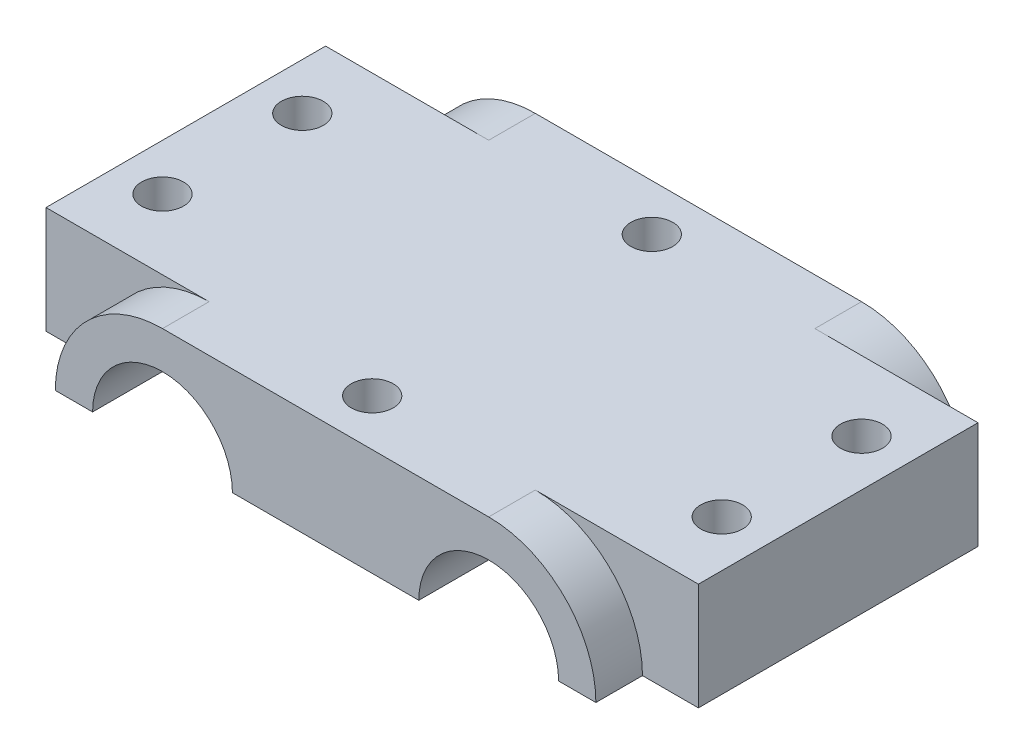
ISO-10303-21;
HEADER;
FILE_DESCRIPTION(('STEP AP214'),'2;1');
FILE_NAME('part.step','',(''),(''),'','','');
FILE_SCHEMA(('AUTOMOTIVE_DESIGN { 1 0 10303 214 1 1 1 1 }'));
ENDSEC;
DATA;
#1=APPLICATION_CONTEXT('core data for automotive mechanical design processes');
#2=APPLICATION_PROTOCOL_DEFINITION('international standard','automotive_design',2000,#1);
#3=PRODUCT_CONTEXT('',#1,'mechanical');
#4=PRODUCT('Part','Part','',(#3));
#5=PRODUCT_RELATED_PRODUCT_CATEGORY('part','',(#4));
#6=PRODUCT_DEFINITION_FORMATION('','',#4);
#7=PRODUCT_DEFINITION_CONTEXT('part definition',#1,'design');
#8=PRODUCT_DEFINITION('design','',#6,#7);
#9=PRODUCT_DEFINITION_SHAPE('','',#8);
#10=(LENGTH_UNIT() NAMED_UNIT(*) SI_UNIT(.MILLI.,.METRE.));
#11=(NAMED_UNIT(*) PLANE_ANGLE_UNIT() SI_UNIT($,.RADIAN.));
#12=(NAMED_UNIT(*) SI_UNIT($,.STERADIAN.) SOLID_ANGLE_UNIT());
#13=UNCERTAINTY_MEASURE_WITH_UNIT(LENGTH_MEASURE(1.E-05),#10,'distance_accuracy_value','');
#14=(GEOMETRIC_REPRESENTATION_CONTEXT(3) GLOBAL_UNCERTAINTY_ASSIGNED_CONTEXT((#13)) GLOBAL_UNIT_ASSIGNED_CONTEXT((#10,
#11,#12)) REPRESENTATION_CONTEXT('',''));
#15=CARTESIAN_POINT('',(0.,0.,0.));
#16=DIRECTION('',(0.,0.,1.));
#17=DIRECTION('',(1.,0.,0.));
#18=AXIS2_PLACEMENT_3D('',#15,#16,#17);
#19=CARTESIAN_POINT('',(-35.,5.75,20.));
#20=DIRECTION('',(0.,-1.,0.));
#21=DIRECTION('',(0.,0.,-1.));
#22=AXIS2_PLACEMENT_3D('',#19,#20,#21);
#23=PLANE('',#22);
#24=CARTESIAN_POINT('',(0.,5.75,-15.));
#25=DIRECTION('',(0.,1.,0.));
#26=DIRECTION('',(0.,0.,1.));
#27=AXIS2_PLACEMENT_3D('',#24,#25,#26);
#28=CIRCLE('',#27,2.24999999999999);
#29=CARTESIAN_POINT('',(0.,5.75,-12.75));
#30=VERTEX_POINT('',#29);
#31=EDGE_CURVE('E531',#30,#30,#28,.T.);
#32=ORIENTED_EDGE('',*,*,#31,.F.);
#33=EDGE_LOOP('',(#32));
#34=FACE_BOUND('',#33,.T.);
#35=CARTESIAN_POINT('',(0.,5.75,15.));
#36=DIRECTION('',(0.,1.,0.));
#37=DIRECTION('',(0.,0.,1.));
#38=AXIS2_PLACEMENT_3D('',#35,#36,#37);
#39=CIRCLE('',#38,2.24999999999999);
#40=CARTESIAN_POINT('',(0.,5.75,17.25));
#41=VERTEX_POINT('',#40);
#42=EDGE_CURVE('E533',#41,#41,#39,.T.);
#43=ORIENTED_EDGE('',*,*,#42,.F.);
#44=EDGE_LOOP('',(#43));
#45=FACE_BOUND('',#44,.T.);
#46=CARTESIAN_POINT('',(-30.,5.75,-7.5));
#47=DIRECTION('',(0.,1.,0.));
#48=DIRECTION('',(0.,0.,1.));
#49=AXIS2_PLACEMENT_3D('',#46,#47,#48);
#50=CIRCLE('',#49,2.25);
#51=CARTESIAN_POINT('',(-30.,5.75,-5.25));
#52=VERTEX_POINT('',#51);
#53=EDGE_CURVE('E541',#52,#52,#50,.T.);
#54=ORIENTED_EDGE('',*,*,#53,.F.);
#55=EDGE_LOOP('',(#54));
#56=FACE_BOUND('',#55,.T.);
#57=CARTESIAN_POINT('',(-30.,5.75,7.5));
#58=DIRECTION('',(0.,1.,0.));
#59=DIRECTION('',(0.,0.,1.));
#60=AXIS2_PLACEMENT_3D('',#57,#58,#59);
#61=CIRCLE('',#60,2.25);
#62=CARTESIAN_POINT('',(-30.,5.75,9.75));
#63=VERTEX_POINT('',#62);
#64=EDGE_CURVE('E547',#63,#63,#61,.T.);
#65=ORIENTED_EDGE('',*,*,#64,.F.);
#66=EDGE_LOOP('',(#65));
#67=FACE_BOUND('',#66,.T.);
#68=CARTESIAN_POINT('',(30.,5.75,7.5));
#69=DIRECTION('',(0.,1.,0.));
#70=DIRECTION('',(0.,0.,1.));
#71=AXIS2_PLACEMENT_3D('',#68,#69,#70);
#72=CIRCLE('',#71,2.25);
#73=CARTESIAN_POINT('',(30.,5.75,9.75));
#74=VERTEX_POINT('',#73);
#75=EDGE_CURVE('E559',#74,#74,#72,.T.);
#76=ORIENTED_EDGE('',*,*,#75,.F.);
#77=EDGE_LOOP('',(#76));
#78=FACE_BOUND('',#77,.T.);
#79=DIRECTION('',(-1.,0.,0.));
#80=VECTOR('',#79,1.);
#81=CARTESIAN_POINT('',(35.,5.75,-15.));
#82=LINE('',#81,#80);
#83=CARTESIAN_POINT('',(35.,5.75,-15.));
#84=VERTEX_POINT('',#83);
#85=CARTESIAN_POINT('',(17.5,5.75,-15.));
#86=VERTEX_POINT('',#85);
#87=EDGE_CURVE('E164',#84,#86,#82,.T.);
#88=ORIENTED_EDGE('',*,*,#87,.T.);
#89=DIRECTION('',(0.,0.,-1.));
#90=VECTOR('',#89,1.);
#91=CARTESIAN_POINT('',(17.5,5.75,-15.));
#92=LINE('',#91,#90);
#93=CARTESIAN_POINT('',(17.5,5.75,-20.));
#94=VERTEX_POINT('',#93);
#95=EDGE_CURVE('E151',#86,#94,#92,.T.);
#96=ORIENTED_EDGE('',*,*,#95,.T.);
#97=DIRECTION('',(-1.,0.,0.));
#98=VECTOR('',#97,1.);
#99=CARTESIAN_POINT('',(-35.,5.75,-20.));
#100=LINE('',#99,#98);
#101=CARTESIAN_POINT('',(-17.5,5.75,-20.));
#102=VERTEX_POINT('',#101);
#103=EDGE_CURVE('E241',#94,#102,#100,.T.);
#104=ORIENTED_EDGE('',*,*,#103,.T.);
#105=DIRECTION('',(0.,0.,-1.));
#106=VECTOR('',#105,1.);
#107=CARTESIAN_POINT('',(-17.5,5.75,-15.));
#108=LINE('',#107,#106);
#109=CARTESIAN_POINT('',(-17.5,5.75,-15.));
#110=VERTEX_POINT('',#109);
#111=EDGE_CURVE('E54',#110,#102,#108,.T.);
#112=ORIENTED_EDGE('',*,*,#111,.F.);
#113=DIRECTION('',(-1.,0.,0.));
#114=VECTOR('',#113,1.);
#115=CARTESIAN_POINT('',(-17.5,5.75,-15.));
#116=LINE('',#115,#114);
#117=CARTESIAN_POINT('',(-35.,5.75,-15.));
#118=VERTEX_POINT('',#117);
#119=EDGE_CURVE('E184',#110,#118,#116,.T.);
#120=ORIENTED_EDGE('',*,*,#119,.T.);
#121=DIRECTION('',(0.,0.,-1.));
#122=VECTOR('',#121,1.);
#123=CARTESIAN_POINT('',(-35.,5.75,20.));
#124=LINE('',#123,#122);
#125=CARTESIAN_POINT('',(-35.,5.75,15.));
#126=VERTEX_POINT('',#125);
#127=EDGE_CURVE('E47',#126,#118,#124,.T.);
#128=ORIENTED_EDGE('',*,*,#127,.F.);
#129=DIRECTION('',(-1.,0.,0.));
#130=VECTOR('',#129,1.);
#131=CARTESIAN_POINT('',(-17.5,5.75,15.));
#132=LINE('',#131,#130);
#133=CARTESIAN_POINT('',(-17.5,5.75,15.));
#134=VERTEX_POINT('',#133);
#135=EDGE_CURVE('E219',#134,#126,#132,.T.);
#136=ORIENTED_EDGE('',*,*,#135,.F.);
#137=DIRECTION('',(0.,0.,1.));
#138=VECTOR('',#137,1.);
#139=CARTESIAN_POINT('',(-17.5,5.75,15.));
#140=LINE('',#139,#138);
#141=CARTESIAN_POINT('',(-17.5,5.75,20.));
#142=VERTEX_POINT('',#141);
#143=EDGE_CURVE('E179',#134,#142,#140,.T.);
#144=ORIENTED_EDGE('',*,*,#143,.T.);
#145=DIRECTION('',(-1.,0.,0.));
#146=VECTOR('',#145,1.);
#147=CARTESIAN_POINT('',(-35.,5.75,20.));
#148=LINE('',#147,#146);
#149=CARTESIAN_POINT('',(17.5,5.75,20.));
#150=VERTEX_POINT('',#149);
#151=EDGE_CURVE('E253',#150,#142,#148,.T.);
#152=ORIENTED_EDGE('',*,*,#151,.F.);
#153=DIRECTION('',(0.,0.,1.));
#154=VECTOR('',#153,1.);
#155=CARTESIAN_POINT('',(17.5,5.75,15.));
#156=LINE('',#155,#154);
#157=CARTESIAN_POINT('',(17.5,5.75,15.));
#158=VERTEX_POINT('',#157);
#159=EDGE_CURVE('E212',#158,#150,#156,.T.);
#160=ORIENTED_EDGE('',*,*,#159,.F.);
#161=DIRECTION('',(-1.,0.,0.));
#162=VECTOR('',#161,1.);
#163=CARTESIAN_POINT('',(35.,5.75,15.));
#164=LINE('',#163,#162);
#165=CARTESIAN_POINT('',(35.,5.75,15.));
#166=VERTEX_POINT('',#165);
#167=EDGE_CURVE('E206',#166,#158,#164,.T.);
#168=ORIENTED_EDGE('',*,*,#167,.F.);
#169=DIRECTION('',(0.,0.,-1.));
#170=VECTOR('',#169,1.);
#171=CARTESIAN_POINT('',(35.,5.75,20.));
#172=LINE('',#171,#170);
#173=EDGE_CURVE('E11',#166,#84,#172,.T.);
#174=ORIENTED_EDGE('',*,*,#173,.T.);
#175=EDGE_LOOP('',(#88,#96,#104,#112,#120,#128,#136,#144,#152,#160,#168,#174));
#176=FACE_BOUND('',#175,.T.);
#177=CARTESIAN_POINT('',(30.,5.75,-7.5));
#178=DIRECTION('',(0.,1.,0.));
#179=DIRECTION('',(0.,0.,1.));
#180=AXIS2_PLACEMENT_3D('',#177,#178,#179);
#181=CIRCLE('',#180,2.25);
#182=CARTESIAN_POINT('',(30.,5.75,-5.25));
#183=VERTEX_POINT('',#182);
#184=EDGE_CURVE('E553',#183,#183,#181,.T.);
#185=ORIENTED_EDGE('',*,*,#184,.F.);
#186=EDGE_LOOP('',(#185));
#187=FACE_BOUND('',#186,.T.);
#188=ADVANCED_FACE('F39',(#34,#45,#56,#67,#78,#176,#187),#23,.F.);
#189=CARTESIAN_POINT('',(35.,5.75,20.));
#190=DIRECTION('',(-1.,0.,0.));
#191=DIRECTION('',(0.,-1.,0.));
#192=AXIS2_PLACEMENT_3D('',#189,#190,#191);
#193=PLANE('',#192);
#194=DIRECTION('',(0.,1.,0.));
#195=VECTOR('',#194,1.);
#196=CARTESIAN_POINT('',(35.,-5.75,-15.));
#197=LINE('',#196,#195);
#198=CARTESIAN_POINT('',(35.,-5.75,-15.));
#199=VERTEX_POINT('',#198);
#200=EDGE_CURVE('E171',#199,#84,#197,.T.);
#201=ORIENTED_EDGE('',*,*,#200,.T.);
#202=ORIENTED_EDGE('',*,*,#173,.F.);
#203=DIRECTION('',(0.,1.,0.));
#204=VECTOR('',#203,1.);
#205=CARTESIAN_POINT('',(35.,-5.75,15.));
#206=LINE('',#205,#204);
#207=CARTESIAN_POINT('',(35.,-5.75,15.));
#208=VERTEX_POINT('',#207);
#209=EDGE_CURVE('E204',#208,#166,#206,.T.);
#210=ORIENTED_EDGE('',*,*,#209,.F.);
#211=DIRECTION('',(0.,0.,-1.));
#212=VECTOR('',#211,1.);
#213=CARTESIAN_POINT('',(35.,-5.75,20.));
#214=LINE('',#213,#212);
#215=EDGE_CURVE('E260',#208,#199,#214,.T.);
#216=ORIENTED_EDGE('',*,*,#215,.T.);
#217=EDGE_LOOP('',(#201,#202,#210,#216));
#218=FACE_BOUND('',#217,.T.);
#219=ADVANCED_FACE('F41',(#218),#193,.F.);
#220=CARTESIAN_POINT('',(-35.,-5.75,20.));
#221=DIRECTION('',(0.,1.,0.));
#222=DIRECTION('',(0.,0.,1.));
#223=AXIS2_PLACEMENT_3D('',#220,#221,#222);
#224=PLANE('',#223);
#225=CARTESIAN_POINT('',(-30.,-5.75,-7.5));
#226=DIRECTION('',(0.,1.,0.));
#227=DIRECTION('',(0.,0.,1.));
#228=AXIS2_PLACEMENT_3D('',#225,#226,#227);
#229=CIRCLE('',#228,2.25);
#230=CARTESIAN_POINT('',(-30.,-5.75,-5.25));
#231=VERTEX_POINT('',#230);
#232=EDGE_CURVE('E544',#231,#231,#229,.T.);
#233=ORIENTED_EDGE('',*,*,#232,.T.);
#234=EDGE_LOOP('',(#233));
#235=FACE_BOUND('',#234,.T.);
#236=CARTESIAN_POINT('',(-30.,-5.75,7.5));
#237=DIRECTION('',(0.,1.,0.));
#238=DIRECTION('',(0.,0.,1.));
#239=AXIS2_PLACEMENT_3D('',#236,#237,#238);
#240=CIRCLE('',#239,2.25);
#241=CARTESIAN_POINT('',(-30.,-5.75,9.75));
#242=VERTEX_POINT('',#241);
#243=EDGE_CURVE('E550',#242,#242,#240,.T.);
#244=ORIENTED_EDGE('',*,*,#243,.T.);
#245=EDGE_LOOP('',(#244));
#246=FACE_BOUND('',#245,.T.);
#247=DIRECTION('',(0.,0.,-1.));
#248=VECTOR('',#247,1.);
#249=CARTESIAN_POINT('',(-29.,-5.75,-15.));
#250=LINE('',#249,#248);
#251=CARTESIAN_POINT('',(-29.,-5.75,-15.));
#252=VERTEX_POINT('',#251);
#253=CARTESIAN_POINT('',(-29.,-5.75,-20.));
#254=VERTEX_POINT('',#253);
#255=EDGE_CURVE('E178',#252,#254,#250,.T.);
#256=ORIENTED_EDGE('',*,*,#255,.T.);
#257=DIRECTION('',(1.,0.,0.));
#258=VECTOR('',#257,1.);
#259=CARTESIAN_POINT('',(-35.,-5.75,-20.));
#260=LINE('',#259,#258);
#261=CARTESIAN_POINT('',(-25.,-5.75,-20.));
#262=VERTEX_POINT('',#261);
#263=EDGE_CURVE('E257',#254,#262,#260,.T.);
#264=ORIENTED_EDGE('',*,*,#263,.T.);
#265=DIRECTION('',(0.,0.,1.));
#266=VECTOR('',#265,1.);
#267=CARTESIAN_POINT('',(-25.,-5.75,-20.));
#268=LINE('',#267,#266);
#269=CARTESIAN_POINT('',(-25.,-5.75,20.));
#270=VERTEX_POINT('',#269);
#271=EDGE_CURVE('E244',#262,#270,#268,.T.);
#272=ORIENTED_EDGE('',*,*,#271,.T.);
#273=DIRECTION('',(1.,0.,0.));
#274=VECTOR('',#273,1.);
#275=CARTESIAN_POINT('',(-35.,-5.75,20.));
#276=LINE('',#275,#274);
#277=CARTESIAN_POINT('',(-29.,-5.75,20.));
#278=VERTEX_POINT('',#277);
#279=EDGE_CURVE('E258',#278,#270,#276,.T.);
#280=ORIENTED_EDGE('',*,*,#279,.F.);
#281=DIRECTION('',(0.,0.,1.));
#282=VECTOR('',#281,1.);
#283=CARTESIAN_POINT('',(-29.,-5.75,15.));
#284=LINE('',#283,#282);
#285=CARTESIAN_POINT('',(-29.,-5.75,15.));
#286=VERTEX_POINT('',#285);
#287=EDGE_CURVE('E217',#286,#278,#284,.T.);
#288=ORIENTED_EDGE('',*,*,#287,.F.);
#289=DIRECTION('',(1.,0.,0.));
#290=VECTOR('',#289,1.);
#291=CARTESIAN_POINT('',(-35.,-5.75,15.));
#292=LINE('',#291,#290);
#293=CARTESIAN_POINT('',(-35.,-5.75,15.));
#294=VERTEX_POINT('',#293);
#295=EDGE_CURVE('E228',#294,#286,#292,.T.);
#296=ORIENTED_EDGE('',*,*,#295,.F.);
#297=DIRECTION('',(0.,0.,-1.));
#298=VECTOR('',#297,1.);
#299=CARTESIAN_POINT('',(-35.,-5.75,20.));
#300=LINE('',#299,#298);
#301=CARTESIAN_POINT('',(-35.,-5.75,-15.));
#302=VERTEX_POINT('',#301);
#303=EDGE_CURVE('E268',#294,#302,#300,.T.);
#304=ORIENTED_EDGE('',*,*,#303,.T.);
#305=DIRECTION('',(1.,0.,0.));
#306=VECTOR('',#305,1.);
#307=CARTESIAN_POINT('',(-35.,-5.75,-15.));
#308=LINE('',#307,#306);
#309=EDGE_CURVE('E190',#302,#252,#308,.T.);
#310=ORIENTED_EDGE('',*,*,#309,.T.);
#311=EDGE_LOOP('',(#256,#264,#272,#280,#288,#296,#304,#310));
#312=FACE_BOUND('',#311,.T.);
#313=ADVANCED_FACE('F282',(#235,#246,#312),#224,.F.);
#314=CARTESIAN_POINT('',(30.,-5.75,-7.5));
#315=DIRECTION('',(0.,1.,0.));
#316=DIRECTION('',(0.,0.,1.));
#317=AXIS2_PLACEMENT_3D('',#314,#315,#316);
#318=CIRCLE('',#317,2.25);
#319=CARTESIAN_POINT('',(30.,-5.75,-5.25));
#320=VERTEX_POINT('',#319);
#321=EDGE_CURVE('E556',#320,#320,#318,.T.);
#322=ORIENTED_EDGE('',*,*,#321,.T.);
#323=EDGE_LOOP('',(#322));
#324=FACE_BOUND('',#323,.T.);
#325=CARTESIAN_POINT('',(30.,-5.75,7.5));
#326=DIRECTION('',(0.,1.,0.));
#327=DIRECTION('',(0.,0.,1.));
#328=AXIS2_PLACEMENT_3D('',#325,#326,#327);
#329=CIRCLE('',#328,2.25);
#330=CARTESIAN_POINT('',(30.,-5.75,9.75));
#331=VERTEX_POINT('',#330);
#332=EDGE_CURVE('E194',#331,#331,#329,.T.);
#333=ORIENTED_EDGE('',*,*,#332,.T.);
#334=EDGE_LOOP('',(#333));
#335=FACE_BOUND('',#334,.T.);
#336=DIRECTION('',(0.,0.,-1.));
#337=VECTOR('',#336,1.);
#338=CARTESIAN_POINT('',(29.,-5.75,-15.));
#339=LINE('',#338,#337);
#340=CARTESIAN_POINT('',(29.,-5.75,-15.));
#341=VERTEX_POINT('',#340);
#342=CARTESIAN_POINT('',(29.,-5.75,-20.));
#343=VERTEX_POINT('',#342);
#344=EDGE_CURVE('E62',#341,#343,#339,.T.);
#345=ORIENTED_EDGE('',*,*,#344,.F.);
#346=DIRECTION('',(1.,0.,0.));
#347=VECTOR('',#346,1.);
#348=CARTESIAN_POINT('',(29.,-5.75,-15.));
#349=LINE('',#348,#347);
#350=EDGE_CURVE('E160',#341,#199,#349,.T.);
#351=ORIENTED_EDGE('',*,*,#350,.T.);
#352=ORIENTED_EDGE('',*,*,#215,.F.);
#353=DIRECTION('',(1.,0.,0.));
#354=VECTOR('',#353,1.);
#355=CARTESIAN_POINT('',(29.,-5.75,15.));
#356=LINE('',#355,#354);
#357=CARTESIAN_POINT('',(29.,-5.75,15.));
#358=VERTEX_POINT('',#357);
#359=EDGE_CURVE('E201',#358,#208,#356,.T.);
#360=ORIENTED_EDGE('',*,*,#359,.F.);
#361=DIRECTION('',(0.,0.,1.));
#362=VECTOR('',#361,1.);
#363=CARTESIAN_POINT('',(29.,-5.75,15.));
#364=LINE('',#363,#362);
#365=CARTESIAN_POINT('',(29.,-5.75,20.));
#366=VERTEX_POINT('',#365);
#367=EDGE_CURVE('E209',#358,#366,#364,.T.);
#368=ORIENTED_EDGE('',*,*,#367,.T.);
#369=CARTESIAN_POINT('',(25.,-5.75,20.));
#370=VERTEX_POINT('',#369);
#371=EDGE_CURVE('E256',#370,#366,#276,.T.);
#372=ORIENTED_EDGE('',*,*,#371,.F.);
#373=DIRECTION('',(0.,0.,1.));
#374=VECTOR('',#373,1.);
#375=CARTESIAN_POINT('',(25.,-5.75,-20.));
#376=LINE('',#375,#374);
#377=CARTESIAN_POINT('',(25.,-5.75,-20.));
#378=VERTEX_POINT('',#377);
#379=EDGE_CURVE('E239',#378,#370,#376,.T.);
#380=ORIENTED_EDGE('',*,*,#379,.F.);
#381=EDGE_CURVE('E263',#378,#343,#260,.T.);
#382=ORIENTED_EDGE('',*,*,#381,.T.);
#383=EDGE_LOOP('',(#345,#351,#352,#360,#368,#372,#380,#382));
#384=FACE_BOUND('',#383,.T.);
#385=ADVANCED_FACE('F304',(#324,#335,#384),#224,.F.);
#386=CARTESIAN_POINT('',(0.,0.,-20.));
#387=DIRECTION('',(0.,0.,1.));
#388=DIRECTION('',(1.,0.,0.));
#389=AXIS2_PLACEMENT_3D('',#386,#387,#388);
#390=PLANE('',#389);
#391=CARTESIAN_POINT('',(17.5,-5.75,-20.));
#392=DIRECTION('',(0.,0.,-1.));
#393=DIRECTION('',(1.,0.,0.));
#394=AXIS2_PLACEMENT_3D('',#391,#392,#393);
#395=CIRCLE('',#394,11.5);
#396=EDGE_CURVE('E155',#94,#343,#395,.T.);
#397=ORIENTED_EDGE('',*,*,#396,.T.);
#398=ORIENTED_EDGE('',*,*,#381,.F.);
#399=CARTESIAN_POINT('',(17.5,-5.75,-20.));
#400=DIRECTION('',(0.,0.,1.));
#401=DIRECTION('',(-1.,0.,0.));
#402=AXIS2_PLACEMENT_3D('',#399,#400,#401);
#403=CIRCLE('',#402,7.5);
#404=CARTESIAN_POINT('',(10.,-5.75,-20.));
#405=VERTEX_POINT('',#404);
#406=EDGE_CURVE('E232',#378,#405,#403,.T.);
#407=ORIENTED_EDGE('',*,*,#406,.T.);
#408=CARTESIAN_POINT('',(-10.,-5.75,-20.));
#409=VERTEX_POINT('',#408);
#410=EDGE_CURVE('E265',#409,#405,#260,.T.);
#411=ORIENTED_EDGE('',*,*,#410,.F.);
#412=CARTESIAN_POINT('',(-17.5,-5.75,-20.));
#413=DIRECTION('',(0.,0.,1.));
#414=DIRECTION('',(1.,0.,0.));
#415=AXIS2_PLACEMENT_3D('',#412,#413,#414);
#416=CIRCLE('',#415,7.5);
#417=EDGE_CURVE('E247',#409,#262,#416,.T.);
#418=ORIENTED_EDGE('',*,*,#417,.T.);
#419=ORIENTED_EDGE('',*,*,#263,.F.);
#420=CARTESIAN_POINT('',(-17.5,-5.75,-20.));
#421=DIRECTION('',(0.,0.,-1.));
#422=DIRECTION('',(-1.,0.,0.));
#423=AXIS2_PLACEMENT_3D('',#420,#421,#422);
#424=CIRCLE('',#423,11.5);
#425=EDGE_CURVE('E185',#254,#102,#424,.T.);
#426=ORIENTED_EDGE('',*,*,#425,.T.);
#427=ORIENTED_EDGE('',*,*,#103,.F.);
#428=EDGE_LOOP('',(#397,#398,#407,#411,#418,#419,#426,#427));
#429=FACE_BOUND('',#428,.T.);
#430=ADVANCED_FACE('F321',(#429),#390,.F.);
#431=CARTESIAN_POINT('',(0.,-5.75,-15.));
#432=DIRECTION('',(0.,1.,0.));
#433=DIRECTION('',(0.,0.,1.));
#434=AXIS2_PLACEMENT_3D('',#431,#432,#433);
#435=CIRCLE('',#434,2.25);
#436=CARTESIAN_POINT('',(0.,-5.75,-12.75));
#437=VERTEX_POINT('',#436);
#438=EDGE_CURVE('E529',#437,#437,#435,.T.);
#439=ORIENTED_EDGE('',*,*,#438,.T.);
#440=EDGE_LOOP('',(#439));
#441=FACE_BOUND('',#440,.T.);
#442=CARTESIAN_POINT('',(0.,-5.75,15.));
#443=DIRECTION('',(0.,1.,0.));
#444=DIRECTION('',(0.,0.,1.));
#445=AXIS2_PLACEMENT_3D('',#442,#443,#444);
#446=CIRCLE('',#445,2.25);
#447=CARTESIAN_POINT('',(0.,-5.75,17.25));
#448=VERTEX_POINT('',#447);
#449=EDGE_CURVE('E538',#448,#448,#446,.T.);
#450=ORIENTED_EDGE('',*,*,#449,.T.);
#451=EDGE_LOOP('',(#450));
#452=FACE_BOUND('',#451,.T.);
#453=ORIENTED_EDGE('',*,*,#410,.T.);
#454=DIRECTION('',(0.,0.,1.));
#455=VECTOR('',#454,1.);
#456=CARTESIAN_POINT('',(10.,-5.75,-20.));
#457=LINE('',#456,#455);
#458=CARTESIAN_POINT('',(10.,-5.75,20.));
#459=VERTEX_POINT('',#458);
#460=EDGE_CURVE('E235',#405,#459,#457,.T.);
#461=ORIENTED_EDGE('',*,*,#460,.T.);
#462=CARTESIAN_POINT('',(-10.,-5.75,20.));
#463=VERTEX_POINT('',#462);
#464=EDGE_CURVE('E261',#463,#459,#276,.T.);
#465=ORIENTED_EDGE('',*,*,#464,.F.);
#466=DIRECTION('',(0.,0.,1.));
#467=VECTOR('',#466,1.);
#468=CARTESIAN_POINT('',(-10.,-5.75,-20.));
#469=LINE('',#468,#467);
#470=EDGE_CURVE('E214',#409,#463,#469,.T.);
#471=ORIENTED_EDGE('',*,*,#470,.F.);
#472=EDGE_LOOP('',(#453,#461,#465,#471));
#473=FACE_BOUND('',#472,.T.);
#474=ADVANCED_FACE('F318',(#441,#452,#473),#224,.F.);
#475=CARTESIAN_POINT('',(-35.,5.75,20.));
#476=DIRECTION('',(1.,0.,0.));
#477=DIRECTION('',(0.,0.,-1.));
#478=AXIS2_PLACEMENT_3D('',#475,#476,#477);
#479=PLANE('',#478);
#480=ORIENTED_EDGE('',*,*,#127,.T.);
#481=DIRECTION('',(0.,-1.,0.));
#482=VECTOR('',#481,1.);
#483=CARTESIAN_POINT('',(-35.,5.75,-15.));
#484=LINE('',#483,#482);
#485=EDGE_CURVE('E181',#118,#302,#484,.T.);
#486=ORIENTED_EDGE('',*,*,#485,.T.);
#487=ORIENTED_EDGE('',*,*,#303,.F.);
#488=DIRECTION('',(0.,-1.,0.));
#489=VECTOR('',#488,1.);
#490=CARTESIAN_POINT('',(-35.,5.75,15.));
#491=LINE('',#490,#489);
#492=EDGE_CURVE('E223',#126,#294,#491,.T.);
#493=ORIENTED_EDGE('',*,*,#492,.F.);
#494=EDGE_LOOP('',(#480,#486,#487,#493));
#495=FACE_BOUND('',#494,.T.);
#496=ADVANCED_FACE('F274',(#495),#479,.F.);
#497=CARTESIAN_POINT('',(0.,0.,20.));
#498=DIRECTION('',(0.,0.,1.));
#499=DIRECTION('',(1.,0.,0.));
#500=AXIS2_PLACEMENT_3D('',#497,#498,#499);
#501=PLANE('',#500);
#502=CARTESIAN_POINT('',(17.5,-5.75,20.));
#503=DIRECTION('',(0.,0.,-1.));
#504=DIRECTION('',(1.,0.,0.));
#505=AXIS2_PLACEMENT_3D('',#502,#503,#504);
#506=CIRCLE('',#505,11.5);
#507=EDGE_CURVE('E202',#150,#366,#506,.T.);
#508=ORIENTED_EDGE('',*,*,#507,.F.);
#509=ORIENTED_EDGE('',*,*,#151,.T.);
#510=CARTESIAN_POINT('',(-17.5,-5.75,20.));
#511=DIRECTION('',(0.,0.,-1.));
#512=DIRECTION('',(-1.,0.,0.));
#513=AXIS2_PLACEMENT_3D('',#510,#511,#512);
#514=CIRCLE('',#513,11.5);
#515=EDGE_CURVE('E211',#278,#142,#514,.T.);
#516=ORIENTED_EDGE('',*,*,#515,.F.);
#517=ORIENTED_EDGE('',*,*,#279,.T.);
#518=CARTESIAN_POINT('',(-17.5,-5.75,20.));
#519=DIRECTION('',(0.,0.,1.));
#520=DIRECTION('',(1.,0.,0.));
#521=AXIS2_PLACEMENT_3D('',#518,#519,#520);
#522=CIRCLE('',#521,7.5);
#523=EDGE_CURVE('E238',#463,#270,#522,.T.);
#524=ORIENTED_EDGE('',*,*,#523,.F.);
#525=ORIENTED_EDGE('',*,*,#464,.T.);
#526=CARTESIAN_POINT('',(17.5,-5.75,20.));
#527=DIRECTION('',(0.,0.,1.));
#528=DIRECTION('',(-1.,0.,0.));
#529=AXIS2_PLACEMENT_3D('',#526,#527,#528);
#530=CIRCLE('',#529,7.5);
#531=EDGE_CURVE('E236',#370,#459,#530,.T.);
#532=ORIENTED_EDGE('',*,*,#531,.F.);
#533=ORIENTED_EDGE('',*,*,#371,.T.);
#534=EDGE_LOOP('',(#508,#509,#516,#517,#524,#525,#532,#533));
#535=FACE_BOUND('',#534,.T.);
#536=ADVANCED_FACE('F296',(#535),#501,.T.);
#537=CARTESIAN_POINT('',(-17.5,-5.75,-20.));
#538=DIRECTION('',(0.,0.,1.));
#539=DIRECTION('',(1.,0.,0.));
#540=AXIS2_PLACEMENT_3D('',#537,#538,#539);
#541=CYLINDRICAL_SURFACE('',#540,7.5);
#542=ORIENTED_EDGE('',*,*,#523,.T.);
#543=ORIENTED_EDGE('',*,*,#271,.F.);
#544=ORIENTED_EDGE('',*,*,#417,.F.);
#545=ORIENTED_EDGE('',*,*,#470,.T.);
#546=EDGE_LOOP('',(#542,#543,#544,#545));
#547=FACE_BOUND('',#546,.T.);
#548=ADVANCED_FACE('F327',(#547),#541,.F.);
#549=CARTESIAN_POINT('',(17.5,-5.75,-20.));
#550=DIRECTION('',(0.,0.,1.));
#551=DIRECTION('',(1.,0.,0.));
#552=AXIS2_PLACEMENT_3D('',#549,#550,#551);
#553=CYLINDRICAL_SURFACE('',#552,7.5);
#554=ORIENTED_EDGE('',*,*,#531,.T.);
#555=ORIENTED_EDGE('',*,*,#460,.F.);
#556=ORIENTED_EDGE('',*,*,#406,.F.);
#557=ORIENTED_EDGE('',*,*,#379,.T.);
#558=EDGE_LOOP('',(#554,#555,#556,#557));
#559=FACE_BOUND('',#558,.T.);
#560=ADVANCED_FACE('F323',(#559),#553,.F.);
#561=CARTESIAN_POINT('',(-17.5,-5.75,15.));
#562=DIRECTION('',(0.,0.,1.));
#563=DIRECTION('',(1.,0.,0.));
#564=AXIS2_PLACEMENT_3D('',#561,#562,#563);
#565=CYLINDRICAL_SURFACE('',#564,11.5);
#566=ORIENTED_EDGE('',*,*,#515,.T.);
#567=ORIENTED_EDGE('',*,*,#143,.F.);
#568=CARTESIAN_POINT('',(-17.5,-5.75,15.));
#569=DIRECTION('',(0.,0.,-1.));
#570=DIRECTION('',(-1.,0.,0.));
#571=AXIS2_PLACEMENT_3D('',#568,#569,#570);
#572=CIRCLE('',#571,11.5);
#573=EDGE_CURVE('E225',#286,#134,#572,.T.);
#574=ORIENTED_EDGE('',*,*,#573,.F.);
#575=ORIENTED_EDGE('',*,*,#287,.T.);
#576=EDGE_LOOP('',(#566,#567,#574,#575));
#577=FACE_BOUND('',#576,.T.);
#578=ADVANCED_FACE('F290',(#577),#565,.T.);
#579=CARTESIAN_POINT('',(-17.5,-5.75,15.));
#580=DIRECTION('',(0.,0.,-1.));
#581=DIRECTION('',(-1.,0.,0.));
#582=AXIS2_PLACEMENT_3D('',#579,#580,#581);
#583=PLANE('',#582);
#584=ORIENTED_EDGE('',*,*,#492,.T.);
#585=ORIENTED_EDGE('',*,*,#295,.T.);
#586=ORIENTED_EDGE('',*,*,#573,.T.);
#587=ORIENTED_EDGE('',*,*,#135,.T.);
#588=EDGE_LOOP('',(#584,#585,#586,#587));
#589=FACE_BOUND('',#588,.T.);
#590=ADVANCED_FACE('F288',(#589),#583,.F.);
#591=CARTESIAN_POINT('',(17.5,-5.75,15.));
#592=DIRECTION('',(0.,0.,1.));
#593=DIRECTION('',(1.,0.,0.));
#594=AXIS2_PLACEMENT_3D('',#591,#592,#593);
#595=CYLINDRICAL_SURFACE('',#594,11.5);
#596=ORIENTED_EDGE('',*,*,#507,.T.);
#597=ORIENTED_EDGE('',*,*,#367,.F.);
#598=CARTESIAN_POINT('',(17.5,-5.75,15.));
#599=DIRECTION('',(0.,0.,-1.));
#600=DIRECTION('',(1.,0.,0.));
#601=AXIS2_PLACEMENT_3D('',#598,#599,#600);
#602=CIRCLE('',#601,11.5);
#603=EDGE_CURVE('E198',#158,#358,#602,.T.);
#604=ORIENTED_EDGE('',*,*,#603,.F.);
#605=ORIENTED_EDGE('',*,*,#159,.T.);
#606=EDGE_LOOP('',(#596,#597,#604,#605));
#607=FACE_BOUND('',#606,.T.);
#608=ADVANCED_FACE('F301',(#607),#595,.T.);
#609=CARTESIAN_POINT('',(17.5,-5.75,15.));
#610=DIRECTION('',(0.,0.,1.));
#611=DIRECTION('',(1.,0.,0.));
#612=AXIS2_PLACEMENT_3D('',#609,#610,#611);
#613=PLANE('',#612);
#614=ORIENTED_EDGE('',*,*,#603,.T.);
#615=ORIENTED_EDGE('',*,*,#359,.T.);
#616=ORIENTED_EDGE('',*,*,#209,.T.);
#617=ORIENTED_EDGE('',*,*,#167,.T.);
#618=EDGE_LOOP('',(#614,#615,#616,#617));
#619=FACE_BOUND('',#618,.T.);
#620=ADVANCED_FACE('F309',(#619),#613,.T.);
#621=CARTESIAN_POINT('',(-17.5,-5.75,-15.));
#622=DIRECTION('',(0.,0.,-1.));
#623=DIRECTION('',(-1.,0.,0.));
#624=AXIS2_PLACEMENT_3D('',#621,#622,#623);
#625=CYLINDRICAL_SURFACE('',#624,11.5);
#626=ORIENTED_EDGE('',*,*,#425,.F.);
#627=ORIENTED_EDGE('',*,*,#255,.F.);
#628=CARTESIAN_POINT('',(-17.5,-5.75,-15.));
#629=DIRECTION('',(0.,0.,-1.));
#630=DIRECTION('',(-1.,0.,0.));
#631=AXIS2_PLACEMENT_3D('',#628,#629,#630);
#632=CIRCLE('',#631,11.5);
#633=EDGE_CURVE('E188',#252,#110,#632,.T.);
#634=ORIENTED_EDGE('',*,*,#633,.T.);
#635=ORIENTED_EDGE('',*,*,#111,.T.);
#636=EDGE_LOOP('',(#626,#627,#634,#635));
#637=FACE_BOUND('',#636,.T.);
#638=ADVANCED_FACE('F328',(#637),#625,.T.);
#639=CARTESIAN_POINT('',(-17.5,-5.75,-15.));
#640=DIRECTION('',(0.,0.,1.));
#641=DIRECTION('',(-1.,0.,0.));
#642=AXIS2_PLACEMENT_3D('',#639,#640,#641);
#643=PLANE('',#642);
#644=ORIENTED_EDGE('',*,*,#485,.F.);
#645=ORIENTED_EDGE('',*,*,#119,.F.);
#646=ORIENTED_EDGE('',*,*,#633,.F.);
#647=ORIENTED_EDGE('',*,*,#309,.F.);
#648=EDGE_LOOP('',(#644,#645,#646,#647));
#649=FACE_BOUND('',#648,.T.);
#650=ADVANCED_FACE('F280',(#649),#643,.F.);
#651=CARTESIAN_POINT('',(17.5,-5.75,-15.));
#652=DIRECTION('',(0.,0.,-1.));
#653=DIRECTION('',(-1.,0.,0.));
#654=AXIS2_PLACEMENT_3D('',#651,#652,#653);
#655=CYLINDRICAL_SURFACE('',#654,11.5);
#656=ORIENTED_EDGE('',*,*,#396,.F.);
#657=ORIENTED_EDGE('',*,*,#95,.F.);
#658=CARTESIAN_POINT('',(17.5,-5.75,-15.));
#659=DIRECTION('',(0.,0.,-1.));
#660=DIRECTION('',(1.,0.,0.));
#661=AXIS2_PLACEMENT_3D('',#658,#659,#660);
#662=CIRCLE('',#661,11.5);
#663=EDGE_CURVE('E154',#86,#341,#662,.T.);
#664=ORIENTED_EDGE('',*,*,#663,.T.);
#665=ORIENTED_EDGE('',*,*,#344,.T.);
#666=EDGE_LOOP('',(#656,#657,#664,#665));
#667=FACE_BOUND('',#666,.T.);
#668=ADVANCED_FACE('F153',(#667),#655,.T.);
#669=CARTESIAN_POINT('',(17.5,-5.75,-15.));
#670=DIRECTION('',(0.,0.,-1.));
#671=DIRECTION('',(1.,0.,0.));
#672=AXIS2_PLACEMENT_3D('',#669,#670,#671);
#673=PLANE('',#672);
#674=ORIENTED_EDGE('',*,*,#663,.F.);
#675=ORIENTED_EDGE('',*,*,#87,.F.);
#676=ORIENTED_EDGE('',*,*,#200,.F.);
#677=ORIENTED_EDGE('',*,*,#350,.F.);
#678=EDGE_LOOP('',(#674,#675,#676,#677));
#679=FACE_BOUND('',#678,.T.);
#680=ADVANCED_FACE('F163',(#679),#673,.T.);
#681=CARTESIAN_POINT('',(30.,5.75,7.5));
#682=DIRECTION('',(0.,1.,0.));
#683=DIRECTION('',(0.,0.,1.));
#684=AXIS2_PLACEMENT_3D('',#681,#682,#683);
#685=CYLINDRICAL_SURFACE('',#684,2.25);
#686=ORIENTED_EDGE('',*,*,#332,.F.);
#687=EDGE_LOOP('',(#686));
#688=FACE_BOUND('',#687,.T.);
#689=ORIENTED_EDGE('',*,*,#75,.T.);
#690=EDGE_LOOP('',(#689));
#691=FACE_BOUND('',#690,.T.);
#692=ADVANCED_FACE('F466',(#688,#691),#685,.F.);
#693=CARTESIAN_POINT('',(30.,5.75,-7.5));
#694=DIRECTION('',(0.,1.,0.));
#695=DIRECTION('',(0.,0.,1.));
#696=AXIS2_PLACEMENT_3D('',#693,#694,#695);
#697=CYLINDRICAL_SURFACE('',#696,2.25);
#698=ORIENTED_EDGE('',*,*,#321,.F.);
#699=EDGE_LOOP('',(#698));
#700=FACE_BOUND('',#699,.T.);
#701=ORIENTED_EDGE('',*,*,#184,.T.);
#702=EDGE_LOOP('',(#701));
#703=FACE_BOUND('',#702,.T.);
#704=ADVANCED_FACE('F473',(#700,#703),#697,.F.);
#705=CARTESIAN_POINT('',(-30.,5.75,7.5));
#706=DIRECTION('',(0.,1.,0.));
#707=DIRECTION('',(0.,0.,1.));
#708=AXIS2_PLACEMENT_3D('',#705,#706,#707);
#709=CYLINDRICAL_SURFACE('',#708,2.25);
#710=ORIENTED_EDGE('',*,*,#243,.F.);
#711=EDGE_LOOP('',(#710));
#712=FACE_BOUND('',#711,.T.);
#713=ORIENTED_EDGE('',*,*,#64,.T.);
#714=EDGE_LOOP('',(#713));
#715=FACE_BOUND('',#714,.T.);
#716=ADVANCED_FACE('F486',(#712,#715),#709,.F.);
#717=CARTESIAN_POINT('',(-30.,5.75,-7.5));
#718=DIRECTION('',(0.,1.,0.));
#719=DIRECTION('',(0.,0.,1.));
#720=AXIS2_PLACEMENT_3D('',#717,#718,#719);
#721=CYLINDRICAL_SURFACE('',#720,2.25);
#722=ORIENTED_EDGE('',*,*,#232,.F.);
#723=EDGE_LOOP('',(#722));
#724=FACE_BOUND('',#723,.T.);
#725=ORIENTED_EDGE('',*,*,#53,.T.);
#726=EDGE_LOOP('',(#725));
#727=FACE_BOUND('',#726,.T.);
#728=ADVANCED_FACE('F495',(#724,#727),#721,.F.);
#729=CARTESIAN_POINT('',(0.,5.75,15.));
#730=DIRECTION('',(0.,1.,0.));
#731=DIRECTION('',(0.,0.,1.));
#732=AXIS2_PLACEMENT_3D('',#729,#730,#731);
#733=CYLINDRICAL_SURFACE('',#732,2.24999999999999);
#734=ORIENTED_EDGE('',*,*,#449,.F.);
#735=EDGE_LOOP('',(#734));
#736=FACE_BOUND('',#735,.T.);
#737=ORIENTED_EDGE('',*,*,#42,.T.);
#738=EDGE_LOOP('',(#737));
#739=FACE_BOUND('',#738,.T.);
#740=ADVANCED_FACE('F504',(#736,#739),#733,.F.);
#741=CARTESIAN_POINT('',(0.,5.75,-15.));
#742=DIRECTION('',(0.,1.,0.));
#743=DIRECTION('',(0.,0.,1.));
#744=AXIS2_PLACEMENT_3D('',#741,#742,#743);
#745=CYLINDRICAL_SURFACE('',#744,2.24999999999999);
#746=ORIENTED_EDGE('',*,*,#438,.F.);
#747=EDGE_LOOP('',(#746));
#748=FACE_BOUND('',#747,.T.);
#749=ORIENTED_EDGE('',*,*,#31,.T.);
#750=EDGE_LOOP('',(#749));
#751=FACE_BOUND('',#750,.T.);
#752=ADVANCED_FACE('F512',(#748,#751),#745,.F.);
#753=CLOSED_SHELL('',(#188,#219,#313,#385,#430,#474,#496,#536,#548,#560,#578,#590,#608,#620,
#638,#650,#668,#680,#692,#704,#716,#728,#740,#752));
#754=MANIFOLD_SOLID_BREP('B2',#753);
#755=ADVANCED_BREP_SHAPE_REPRESENTATION('',(#18,#754),#14);
#756=SHAPE_DEFINITION_REPRESENTATION(#9,#755);
ENDSEC;
END-ISO-10303-21;
